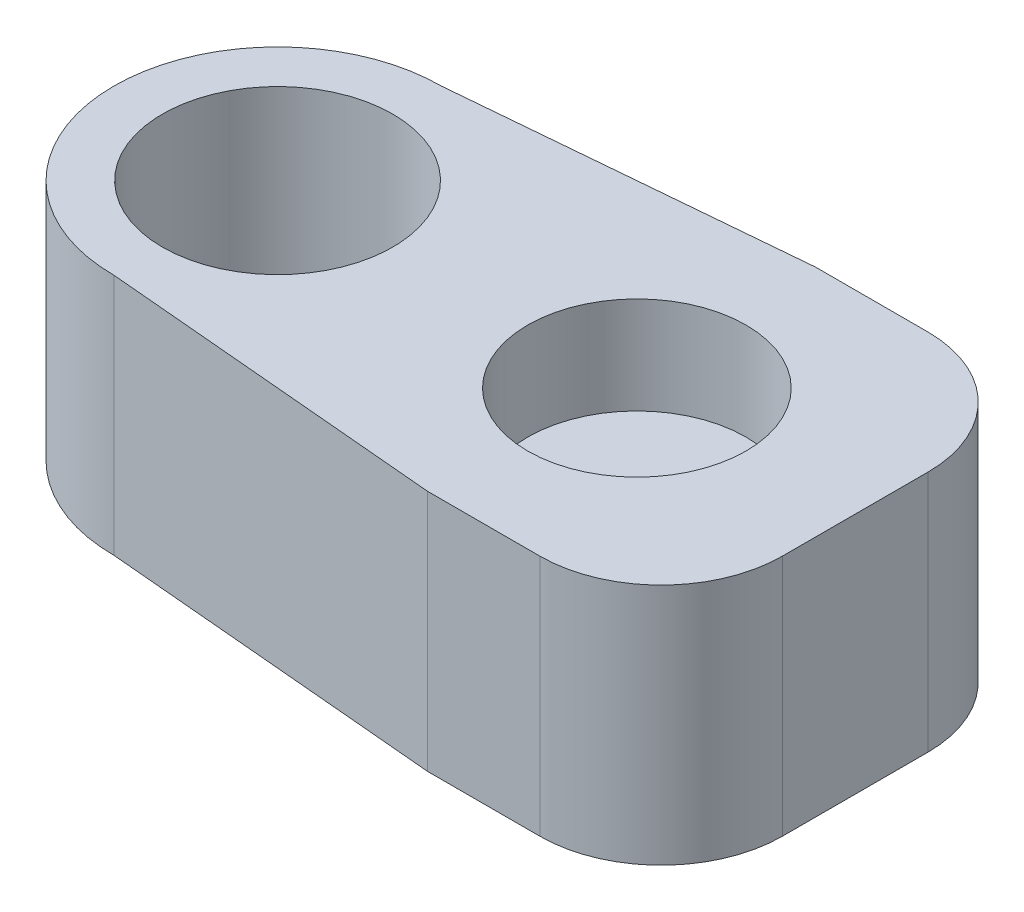
ISO-10303-21;
HEADER;
FILE_DESCRIPTION(('STEP AP214'),'2;1');
FILE_NAME('part.step','',(''),(''),'','','');
FILE_SCHEMA(('AUTOMOTIVE_DESIGN { 1 0 10303 214 1 1 1 1 }'));
ENDSEC;
DATA;
#1=APPLICATION_CONTEXT('core data for automotive mechanical design processes');
#2=APPLICATION_PROTOCOL_DEFINITION('international standard','automotive_design',2000,#1);
#3=PRODUCT_CONTEXT('',#1,'mechanical');
#4=PRODUCT('Part','Part','',(#3));
#5=PRODUCT_RELATED_PRODUCT_CATEGORY('part','',(#4));
#6=PRODUCT_DEFINITION_FORMATION('','',#4);
#7=PRODUCT_DEFINITION_CONTEXT('part definition',#1,'design');
#8=PRODUCT_DEFINITION('design','',#6,#7);
#9=PRODUCT_DEFINITION_SHAPE('','',#8);
#10=(LENGTH_UNIT() NAMED_UNIT(*) SI_UNIT(.MILLI.,.METRE.));
#11=(NAMED_UNIT(*) PLANE_ANGLE_UNIT() SI_UNIT($,.RADIAN.));
#12=(NAMED_UNIT(*) SI_UNIT($,.STERADIAN.) SOLID_ANGLE_UNIT());
#13=UNCERTAINTY_MEASURE_WITH_UNIT(LENGTH_MEASURE(1.E-05),#10,'distance_accuracy_value','');
#14=(GEOMETRIC_REPRESENTATION_CONTEXT(3) GLOBAL_UNCERTAINTY_ASSIGNED_CONTEXT((#13)) GLOBAL_UNIT_ASSIGNED_CONTEXT((#10,
#11,#12)) REPRESENTATION_CONTEXT('',''));
#15=CARTESIAN_POINT('',(0.,0.,0.));
#16=DIRECTION('',(0.,0.,1.));
#17=DIRECTION('',(1.,0.,0.));
#18=AXIS2_PLACEMENT_3D('',#15,#16,#17);
#19=CARTESIAN_POINT('',(-0.656258948967261,10.,-7.44412914173938));
#20=DIRECTION('',(0.0878173312896641,0.,0.996136595214312));
#21=DIRECTION('',(0.996136595214312,0.,-0.0878173312896641));
#22=AXIS2_PLACEMENT_3D('',#19,#20,#21);
#23=PLANE('',#22);
#24=DIRECTION('',(-0.996136595214312,0.,0.0878173312896641));
#25=VECTOR('',#24,1.);
#26=CARTESIAN_POINT('',(-0.656258948967261,0.,-7.44412914173938));
#27=LINE('',#26,#25);
#28=CARTESIAN_POINT('',(5.64913995116722,0.,-8.));
#29=VERTEX_POINT('',#28);
#30=CARTESIAN_POINT('',(-8.52996029853992,0.,-6.75));
#31=VERTEX_POINT('',#30);
#32=EDGE_CURVE('E142',#29,#31,#27,.T.);
#33=ORIENTED_EDGE('',*,*,#32,.T.);
#34=DIRECTION('',(0.,-1.,0.));
#35=VECTOR('',#34,1.);
#36=CARTESIAN_POINT('',(-8.52996029853992,10.,-6.75));
#37=LINE('',#36,#35);
#38=CARTESIAN_POINT('',(-8.52996029853992,10.,-6.75));
#39=VERTEX_POINT('',#38);
#40=EDGE_CURVE('E11',#39,#31,#37,.T.);
#41=ORIENTED_EDGE('',*,*,#40,.F.);
#42=DIRECTION('',(-0.996136595214312,0.,0.0878173312896641));
#43=VECTOR('',#42,1.);
#44=CARTESIAN_POINT('',(-0.656258948967261,10.,-7.44412914173938));
#45=LINE('',#44,#43);
#46=CARTESIAN_POINT('',(5.64913995116722,10.,-8.));
#47=VERTEX_POINT('',#46);
#48=EDGE_CURVE('E169',#47,#39,#45,.T.);
#49=ORIENTED_EDGE('',*,*,#48,.F.);
#50=DIRECTION('',(0.,-1.,0.));
#51=VECTOR('',#50,1.);
#52=CARTESIAN_POINT('',(5.64913995116722,10.,-8.));
#53=LINE('',#52,#51);
#54=EDGE_CURVE('E52',#47,#29,#53,.T.);
#55=ORIENTED_EDGE('',*,*,#54,.T.);
#56=EDGE_LOOP('',(#33,#41,#49,#55));
#57=FACE_BOUND('',#56,.T.);
#58=ADVANCED_FACE('F36',(#57),#23,.F.);
#59=CARTESIAN_POINT('',(-8.52998014926995,10.,1.9850730054085E-05));
#60=DIRECTION('',(0.,-1.,0.));
#61=DIRECTION('',(0.,0.,-1.));
#62=AXIS2_PLACEMENT_3D('',#59,#60,#61);
#63=CYLINDRICAL_SURFACE('',#62,6.75001985075924);
#64=CARTESIAN_POINT('',(-8.52998014926995,0.,1.9850730054085E-05));
#65=DIRECTION('',(0.,1.,0.));
#66=DIRECTION('',(0.,0.,1.));
#67=AXIS2_PLACEMENT_3D('',#64,#65,#66);
#68=CIRCLE('',#67,6.75001985075924);
#69=CARTESIAN_POINT('',(-15.28,0.,0.));
#70=VERTEX_POINT('',#69);
#71=EDGE_CURVE('E144',#31,#70,#68,.T.);
#72=ORIENTED_EDGE('',*,*,#71,.T.);
#73=DIRECTION('',(0.,-1.,0.));
#74=VECTOR('',#73,1.);
#75=CARTESIAN_POINT('',(-15.28,10.,0.));
#76=LINE('',#75,#74);
#77=CARTESIAN_POINT('',(-15.28,10.,0.));
#78=VERTEX_POINT('',#77);
#79=EDGE_CURVE('E44',#78,#70,#76,.T.);
#80=ORIENTED_EDGE('',*,*,#79,.F.);
#81=CARTESIAN_POINT('',(-8.52998014926995,10.,1.9850730054085E-05));
#82=DIRECTION('',(0.,1.,0.));
#83=DIRECTION('',(0.,0.,1.));
#84=AXIS2_PLACEMENT_3D('',#81,#82,#83);
#85=CIRCLE('',#84,6.75001985075924);
#86=EDGE_CURVE('E94',#39,#78,#85,.T.);
#87=ORIENTED_EDGE('',*,*,#86,.F.);
#88=ORIENTED_EDGE('',*,*,#40,.T.);
#89=EDGE_LOOP('',(#72,#80,#87,#88));
#90=FACE_BOUND('',#89,.T.);
#91=ADVANCED_FACE('F184',(#90),#63,.T.);
#92=CARTESIAN_POINT('',(-8.52998014926995,10.,-1.9850730054085E-05));
#93=DIRECTION('',(0.,-1.,0.));
#94=DIRECTION('',(0.,0.,-1.));
#95=AXIS2_PLACEMENT_3D('',#92,#93,#94);
#96=CYLINDRICAL_SURFACE('',#95,6.75001985075924);
#97=CARTESIAN_POINT('',(-8.52998014926995,0.,-1.9850730054085E-05));
#98=DIRECTION('',(0.,1.,0.));
#99=DIRECTION('',(0.,0.,1.));
#100=AXIS2_PLACEMENT_3D('',#97,#98,#99);
#101=CIRCLE('',#100,6.75001985075924);
#102=CARTESIAN_POINT('',(-8.52996029853992,0.,6.75));
#103=VERTEX_POINT('',#102);
#104=EDGE_CURVE('E148',#103,#70,#101,.F.);
#105=ORIENTED_EDGE('',*,*,#104,.F.);
#106=DIRECTION('',(0.,-1.,0.));
#107=VECTOR('',#106,1.);
#108=CARTESIAN_POINT('',(-8.52996029853992,10.,6.75));
#109=LINE('',#108,#107);
#110=CARTESIAN_POINT('',(-8.52996029853992,10.,6.75));
#111=VERTEX_POINT('',#110);
#112=EDGE_CURVE('E177',#111,#103,#109,.T.);
#113=ORIENTED_EDGE('',*,*,#112,.F.);
#114=CARTESIAN_POINT('',(-8.52998014926995,10.,-1.9850730054085E-05));
#115=DIRECTION('',(0.,1.,0.));
#116=DIRECTION('',(0.,0.,1.));
#117=AXIS2_PLACEMENT_3D('',#114,#115,#116);
#118=CIRCLE('',#117,6.75001985075924);
#119=EDGE_CURVE('E183',#111,#78,#118,.F.);
#120=ORIENTED_EDGE('',*,*,#119,.T.);
#121=ORIENTED_EDGE('',*,*,#79,.T.);
#122=EDGE_LOOP('',(#105,#113,#120,#121));
#123=FACE_BOUND('',#122,.T.);
#124=ADVANCED_FACE('F181',(#123),#96,.T.);
#125=CARTESIAN_POINT('',(-0.656258948967261,10.,7.44412914173938));
#126=DIRECTION('',(-0.0878173312896641,0.,0.996136595214312));
#127=DIRECTION('',(0.996136595214312,0.,0.0878173312896641));
#128=AXIS2_PLACEMENT_3D('',#125,#126,#127);
#129=PLANE('',#128);
#130=DIRECTION('',(-0.996136595214312,0.,-0.0878173312896641));
#131=VECTOR('',#130,1.);
#132=CARTESIAN_POINT('',(-0.656258948967261,0.,7.44412914173938));
#133=LINE('',#132,#131);
#134=CARTESIAN_POINT('',(5.64913995116722,0.,8.));
#135=VERTEX_POINT('',#134);
#136=EDGE_CURVE('E151',#135,#103,#133,.T.);
#137=ORIENTED_EDGE('',*,*,#136,.F.);
#138=DIRECTION('',(0.,-1.,0.));
#139=VECTOR('',#138,1.);
#140=CARTESIAN_POINT('',(5.64913995116722,10.,8.));
#141=LINE('',#140,#139);
#142=CARTESIAN_POINT('',(5.64913995116722,10.,8.));
#143=VERTEX_POINT('',#142);
#144=EDGE_CURVE('E175',#143,#135,#141,.T.);
#145=ORIENTED_EDGE('',*,*,#144,.F.);
#146=DIRECTION('',(-0.996136595214312,0.,-0.0878173312896641));
#147=VECTOR('',#146,1.);
#148=CARTESIAN_POINT('',(-0.656258948967261,10.,7.44412914173938));
#149=LINE('',#148,#147);
#150=EDGE_CURVE('E196',#143,#111,#149,.T.);
#151=ORIENTED_EDGE('',*,*,#150,.T.);
#152=ORIENTED_EDGE('',*,*,#112,.T.);
#153=EDGE_LOOP('',(#137,#145,#151,#152));
#154=FACE_BOUND('',#153,.T.);
#155=ADVANCED_FACE('F192',(#154),#129,.T.);
#156=CARTESIAN_POINT('',(0.,10.,8.));
#157=DIRECTION('',(0.,0.,-1.));
#158=DIRECTION('',(-1.,0.,0.));
#159=AXIS2_PLACEMENT_3D('',#156,#157,#158);
#160=PLANE('',#159);
#161=DIRECTION('',(1.,0.,0.));
#162=VECTOR('',#161,1.);
#163=CARTESIAN_POINT('',(0.,0.,8.));
#164=LINE('',#163,#162);
#165=CARTESIAN_POINT('',(10.28,0.,8.));
#166=VERTEX_POINT('',#165);
#167=EDGE_CURVE('E154',#135,#166,#164,.T.);
#168=ORIENTED_EDGE('',*,*,#167,.T.);
#169=DIRECTION('',(0.,-1.,0.));
#170=VECTOR('',#169,1.);
#171=CARTESIAN_POINT('',(10.28,10.,8.));
#172=LINE('',#171,#170);
#173=CARTESIAN_POINT('',(10.28,10.,8.));
#174=VERTEX_POINT('',#173);
#175=EDGE_CURVE('E173',#174,#166,#172,.T.);
#176=ORIENTED_EDGE('',*,*,#175,.F.);
#177=DIRECTION('',(1.,0.,0.));
#178=VECTOR('',#177,1.);
#179=CARTESIAN_POINT('',(0.,10.,8.));
#180=LINE('',#179,#178);
#181=EDGE_CURVE('E198',#143,#174,#180,.T.);
#182=ORIENTED_EDGE('',*,*,#181,.F.);
#183=ORIENTED_EDGE('',*,*,#144,.T.);
#184=EDGE_LOOP('',(#168,#176,#182,#183));
#185=FACE_BOUND('',#184,.T.);
#186=ADVANCED_FACE('F317',(#185),#160,.F.);
#187=CARTESIAN_POINT('',(10.28,10.,3.));
#188=DIRECTION('',(0.,-1.,0.));
#189=DIRECTION('',(0.,0.,-1.));
#190=AXIS2_PLACEMENT_3D('',#187,#188,#189);
#191=CYLINDRICAL_SURFACE('',#190,5.);
#192=CARTESIAN_POINT('',(10.28,0.,3.));
#193=DIRECTION('',(0.,1.,0.));
#194=DIRECTION('',(0.,0.,1.));
#195=AXIS2_PLACEMENT_3D('',#192,#193,#194);
#196=CIRCLE('',#195,5.);
#197=CARTESIAN_POINT('',(15.28,0.,2.99999999999996));
#198=VERTEX_POINT('',#197);
#199=EDGE_CURVE('E157',#198,#166,#196,.F.);
#200=ORIENTED_EDGE('',*,*,#199,.F.);
#201=DIRECTION('',(0.,-1.,0.));
#202=VECTOR('',#201,1.);
#203=CARTESIAN_POINT('',(15.28,10.,2.99999999999996));
#204=LINE('',#203,#202);
#205=CARTESIAN_POINT('',(15.28,10.,2.99999999999996));
#206=VERTEX_POINT('',#205);
#207=EDGE_CURVE('E131',#206,#198,#204,.T.);
#208=ORIENTED_EDGE('',*,*,#207,.F.);
#209=CARTESIAN_POINT('',(10.28,10.,3.));
#210=DIRECTION('',(0.,1.,0.));
#211=DIRECTION('',(0.,0.,1.));
#212=AXIS2_PLACEMENT_3D('',#209,#210,#211);
#213=CIRCLE('',#212,5.);
#214=EDGE_CURVE('E121',#206,#174,#213,.F.);
#215=ORIENTED_EDGE('',*,*,#214,.T.);
#216=ORIENTED_EDGE('',*,*,#175,.T.);
#217=EDGE_LOOP('',(#200,#208,#215,#216));
#218=FACE_BOUND('',#217,.T.);
#219=ADVANCED_FACE('F205',(#218),#191,.T.);
#220=CARTESIAN_POINT('',(15.28,10.,0.));
#221=DIRECTION('',(-1.,0.,0.));
#222=DIRECTION('',(0.,0.,1.));
#223=AXIS2_PLACEMENT_3D('',#220,#221,#222);
#224=PLANE('',#223);
#225=DIRECTION('',(0.,0.,-1.));
#226=VECTOR('',#225,1.);
#227=CARTESIAN_POINT('',(15.28,0.,0.));
#228=LINE('',#227,#226);
#229=CARTESIAN_POINT('',(15.28,0.,-2.99999999999996));
#230=VERTEX_POINT('',#229);
#231=EDGE_CURVE('E128',#198,#230,#228,.T.);
#232=ORIENTED_EDGE('',*,*,#231,.T.);
#233=DIRECTION('',(0.,-1.,0.));
#234=VECTOR('',#233,1.);
#235=CARTESIAN_POINT('',(15.28,10.,-2.99999999999996));
#236=LINE('',#235,#234);
#237=CARTESIAN_POINT('',(15.28,10.,-2.99999999999996));
#238=VERTEX_POINT('',#237);
#239=EDGE_CURVE('E125',#238,#230,#236,.T.);
#240=ORIENTED_EDGE('',*,*,#239,.F.);
#241=DIRECTION('',(0.,0.,-1.));
#242=VECTOR('',#241,1.);
#243=CARTESIAN_POINT('',(15.28,10.,0.));
#244=LINE('',#243,#242);
#245=EDGE_CURVE('E113',#206,#238,#244,.T.);
#246=ORIENTED_EDGE('',*,*,#245,.F.);
#247=ORIENTED_EDGE('',*,*,#207,.T.);
#248=EDGE_LOOP('',(#232,#240,#246,#247));
#249=FACE_BOUND('',#248,.T.);
#250=ADVANCED_FACE('F126',(#249),#224,.F.);
#251=CARTESIAN_POINT('',(10.28,10.,-3.));
#252=DIRECTION('',(0.,-1.,0.));
#253=DIRECTION('',(0.,0.,-1.));
#254=AXIS2_PLACEMENT_3D('',#251,#252,#253);
#255=CYLINDRICAL_SURFACE('',#254,5.);
#256=CARTESIAN_POINT('',(10.28,0.,-3.));
#257=DIRECTION('',(0.,1.,0.));
#258=DIRECTION('',(0.,0.,1.));
#259=AXIS2_PLACEMENT_3D('',#256,#257,#258);
#260=CIRCLE('',#259,5.);
#261=CARTESIAN_POINT('',(10.28,0.,-8.));
#262=VERTEX_POINT('',#261);
#263=EDGE_CURVE('E161',#230,#262,#260,.T.);
#264=ORIENTED_EDGE('',*,*,#263,.T.);
#265=DIRECTION('',(0.,-1.,0.));
#266=VECTOR('',#265,1.);
#267=CARTESIAN_POINT('',(10.28,10.,-8.));
#268=LINE('',#267,#266);
#269=CARTESIAN_POINT('',(10.28,10.,-8.));
#270=VERTEX_POINT('',#269);
#271=EDGE_CURVE('E82',#270,#262,#268,.T.);
#272=ORIENTED_EDGE('',*,*,#271,.F.);
#273=CARTESIAN_POINT('',(10.28,10.,-3.));
#274=DIRECTION('',(0.,1.,0.));
#275=DIRECTION('',(0.,0.,1.));
#276=AXIS2_PLACEMENT_3D('',#273,#274,#275);
#277=CIRCLE('',#276,5.);
#278=EDGE_CURVE('E119',#238,#270,#277,.T.);
#279=ORIENTED_EDGE('',*,*,#278,.F.);
#280=ORIENTED_EDGE('',*,*,#239,.T.);
#281=EDGE_LOOP('',(#264,#272,#279,#280));
#282=FACE_BOUND('',#281,.T.);
#283=ADVANCED_FACE('F133',(#282),#255,.T.);
#284=CARTESIAN_POINT('',(0.,10.,-8.));
#285=DIRECTION('',(0.,0.,-1.));
#286=DIRECTION('',(-1.,0.,0.));
#287=AXIS2_PLACEMENT_3D('',#284,#285,#286);
#288=PLANE('',#287);
#289=DIRECTION('',(1.,0.,0.));
#290=VECTOR('',#289,1.);
#291=CARTESIAN_POINT('',(0.,0.,-8.));
#292=LINE('',#291,#290);
#293=EDGE_CURVE('E163',#29,#262,#292,.T.);
#294=ORIENTED_EDGE('',*,*,#293,.F.);
#295=ORIENTED_EDGE('',*,*,#54,.F.);
#296=DIRECTION('',(1.,0.,0.));
#297=VECTOR('',#296,1.);
#298=CARTESIAN_POINT('',(0.,10.,-8.));
#299=LINE('',#298,#297);
#300=EDGE_CURVE('E134',#47,#270,#299,.T.);
#301=ORIENTED_EDGE('',*,*,#300,.T.);
#302=ORIENTED_EDGE('',*,*,#271,.T.);
#303=EDGE_LOOP('',(#294,#295,#301,#302));
#304=FACE_BOUND('',#303,.T.);
#305=ADVANCED_FACE('F207',(#304),#288,.T.);
#306=CARTESIAN_POINT('',(-8.52996029853992,10.,0.));
#307=DIRECTION('',(0.,-1.,0.));
#308=DIRECTION('',(0.,0.,-1.));
#309=AXIS2_PLACEMENT_3D('',#306,#307,#308);
#310=CYLINDRICAL_SURFACE('',#309,4.75);
#311=CARTESIAN_POINT('',(-8.52996029853992,10.,0.));
#312=DIRECTION('',(0.,1.,0.));
#313=DIRECTION('',(0.,0.,1.));
#314=AXIS2_PLACEMENT_3D('',#311,#312,#313);
#315=CIRCLE('',#314,4.75);
#316=CARTESIAN_POINT('',(-8.52996029853992,10.,4.75));
#317=VERTEX_POINT('',#316);
#318=EDGE_CURVE('E136',#317,#317,#315,.T.);
#319=ORIENTED_EDGE('',*,*,#318,.T.);
#320=EDGE_LOOP('',(#319));
#321=FACE_BOUND('',#320,.T.);
#322=CARTESIAN_POINT('',(-8.52996029853992,0.,0.));
#323=DIRECTION('',(0.,1.,0.));
#324=DIRECTION('',(0.,0.,1.));
#325=AXIS2_PLACEMENT_3D('',#322,#323,#324);
#326=CIRCLE('',#325,4.75);
#327=CARTESIAN_POINT('',(-8.52996029853992,0.,4.75));
#328=VERTEX_POINT('',#327);
#329=EDGE_CURVE('E166',#328,#328,#326,.T.);
#330=ORIENTED_EDGE('',*,*,#329,.F.);
#331=EDGE_LOOP('',(#330));
#332=FACE_BOUND('',#331,.T.);
#333=ADVANCED_FACE('F209',(#321,#332),#310,.F.);
#334=CARTESIAN_POINT('',(0.,10.,0.));
#335=DIRECTION('',(0.,1.,0.));
#336=DIRECTION('',(0.,0.,1.));
#337=AXIS2_PLACEMENT_3D('',#334,#335,#336);
#338=PLANE('',#337);
#339=CARTESIAN_POINT('',(6.28003970146008,10.,0.));
#340=DIRECTION('',(0.,1.,0.));
#341=DIRECTION('',(0.,0.,1.));
#342=AXIS2_PLACEMENT_3D('',#339,#340,#341);
#343=CIRCLE('',#342,4.5);
#344=CARTESIAN_POINT('',(6.28003970146008,10.,4.5));
#345=VERTEX_POINT('',#344);
#346=EDGE_CURVE('E223',#345,#345,#343,.T.);
#347=ORIENTED_EDGE('',*,*,#346,.F.);
#348=EDGE_LOOP('',(#347));
#349=FACE_BOUND('',#348,.T.);
#350=ORIENTED_EDGE('',*,*,#48,.T.);
#351=ORIENTED_EDGE('',*,*,#86,.T.);
#352=ORIENTED_EDGE('',*,*,#119,.F.);
#353=ORIENTED_EDGE('',*,*,#150,.F.);
#354=ORIENTED_EDGE('',*,*,#181,.T.);
#355=ORIENTED_EDGE('',*,*,#214,.F.);
#356=ORIENTED_EDGE('',*,*,#245,.T.);
#357=ORIENTED_EDGE('',*,*,#278,.T.);
#358=ORIENTED_EDGE('',*,*,#300,.F.);
#359=EDGE_LOOP('',(#350,#351,#352,#353,#354,#355,#356,#357,#358));
#360=FACE_BOUND('',#359,.T.);
#361=ORIENTED_EDGE('',*,*,#318,.F.);
#362=EDGE_LOOP('',(#361));
#363=FACE_BOUND('',#362,.T.);
#364=ADVANCED_FACE('F115',(#349,#360,#363),#338,.T.);
#365=CARTESIAN_POINT('',(0.,0.,0.));
#366=DIRECTION('',(0.,1.,0.));
#367=DIRECTION('',(0.,0.,1.));
#368=AXIS2_PLACEMENT_3D('',#365,#366,#367);
#369=PLANE('',#368);
#370=CARTESIAN_POINT('',(6.28003970146008,0.,0.));
#371=DIRECTION('',(0.,-1.,0.));
#372=DIRECTION('',(0.,0.,-1.));
#373=AXIS2_PLACEMENT_3D('',#370,#371,#372);
#374=CIRCLE('',#373,4.5);
#375=CARTESIAN_POINT('',(6.28003970146008,0.,-4.5));
#376=VERTEX_POINT('',#375);
#377=EDGE_CURVE('E229',#376,#376,#374,.T.);
#378=ORIENTED_EDGE('',*,*,#377,.F.);
#379=EDGE_LOOP('',(#378));
#380=FACE_BOUND('',#379,.T.);
#381=ORIENTED_EDGE('',*,*,#32,.F.);
#382=ORIENTED_EDGE('',*,*,#293,.T.);
#383=ORIENTED_EDGE('',*,*,#263,.F.);
#384=ORIENTED_EDGE('',*,*,#231,.F.);
#385=ORIENTED_EDGE('',*,*,#199,.T.);
#386=ORIENTED_EDGE('',*,*,#167,.F.);
#387=ORIENTED_EDGE('',*,*,#136,.T.);
#388=ORIENTED_EDGE('',*,*,#104,.T.);
#389=ORIENTED_EDGE('',*,*,#71,.F.);
#390=EDGE_LOOP('',(#381,#382,#383,#384,#385,#386,#387,#388,#389));
#391=FACE_BOUND('',#390,.T.);
#392=ORIENTED_EDGE('',*,*,#329,.T.);
#393=EDGE_LOOP('',(#392));
#394=FACE_BOUND('',#393,.T.);
#395=ADVANCED_FACE('F187',(#380,#391,#394),#369,.F.);
#396=CARTESIAN_POINT('',(6.28003970146008,6.,0.));
#397=DIRECTION('',(0.,1.,0.));
#398=DIRECTION('',(0.,0.,1.));
#399=AXIS2_PLACEMENT_3D('',#396,#397,#398);
#400=CYLINDRICAL_SURFACE('',#399,4.5);
#401=CARTESIAN_POINT('',(6.28003970146008,6.,0.));
#402=DIRECTION('',(0.,1.,0.));
#403=DIRECTION('',(0.,0.,1.));
#404=AXIS2_PLACEMENT_3D('',#401,#402,#403);
#405=CIRCLE('',#404,4.5);
#406=CARTESIAN_POINT('',(6.28003970146008,6.,4.5));
#407=VERTEX_POINT('',#406);
#408=EDGE_CURVE('E145',#407,#407,#405,.T.);
#409=ORIENTED_EDGE('',*,*,#408,.F.);
#410=EDGE_LOOP('',(#409));
#411=FACE_BOUND('',#410,.T.);
#412=ORIENTED_EDGE('',*,*,#346,.T.);
#413=EDGE_LOOP('',(#412));
#414=FACE_BOUND('',#413,.T.);
#415=ADVANCED_FACE('F245',(#411,#414),#400,.F.);
#416=CARTESIAN_POINT('',(0.,6.,0.));
#417=DIRECTION('',(0.,1.,0.));
#418=DIRECTION('',(0.,0.,1.));
#419=AXIS2_PLACEMENT_3D('',#416,#417,#418);
#420=PLANE('',#419);
#421=ORIENTED_EDGE('',*,*,#408,.T.);
#422=EDGE_LOOP('',(#421));
#423=FACE_BOUND('',#422,.T.);
#424=ADVANCED_FACE('F240',(#423),#420,.T.);
#425=CARTESIAN_POINT('',(6.28003970146008,4.,0.));
#426=DIRECTION('',(0.,-1.,0.));
#427=DIRECTION('',(0.,0.,-1.));
#428=AXIS2_PLACEMENT_3D('',#425,#426,#427);
#429=CYLINDRICAL_SURFACE('',#428,4.5);
#430=CARTESIAN_POINT('',(6.28003970146008,4.,0.));
#431=DIRECTION('',(0.,-1.,0.));
#432=DIRECTION('',(0.,0.,-1.));
#433=AXIS2_PLACEMENT_3D('',#430,#431,#432);
#434=CIRCLE('',#433,4.5);
#435=CARTESIAN_POINT('',(6.28003970146008,4.,-4.5));
#436=VERTEX_POINT('',#435);
#437=EDGE_CURVE('E226',#436,#436,#434,.T.);
#438=ORIENTED_EDGE('',*,*,#437,.F.);
#439=EDGE_LOOP('',(#438));
#440=FACE_BOUND('',#439,.T.);
#441=ORIENTED_EDGE('',*,*,#377,.T.);
#442=EDGE_LOOP('',(#441));
#443=FACE_BOUND('',#442,.T.);
#444=ADVANCED_FACE('F237',(#440,#443),#429,.F.);
#445=CARTESIAN_POINT('',(0.,4.,0.));
#446=DIRECTION('',(0.,-1.,0.));
#447=DIRECTION('',(0.,0.,-1.));
#448=AXIS2_PLACEMENT_3D('',#445,#446,#447);
#449=PLANE('',#448);
#450=ORIENTED_EDGE('',*,*,#437,.T.);
#451=EDGE_LOOP('',(#450));
#452=FACE_BOUND('',#451,.T.);
#453=ADVANCED_FACE('F235',(#452),#449,.T.);
#454=CLOSED_SHELL('',(#58,#91,#124,#155,#186,#219,#250,#283,#305,#333,#364,#395,#415,#424,#444,#453));
#455=MANIFOLD_SOLID_BREP('B2',#454);
#456=ADVANCED_BREP_SHAPE_REPRESENTATION('',(#18,#455),#14);
#457=SHAPE_DEFINITION_REPRESENTATION(#9,#456);
ENDSEC;
END-ISO-10303-21;
